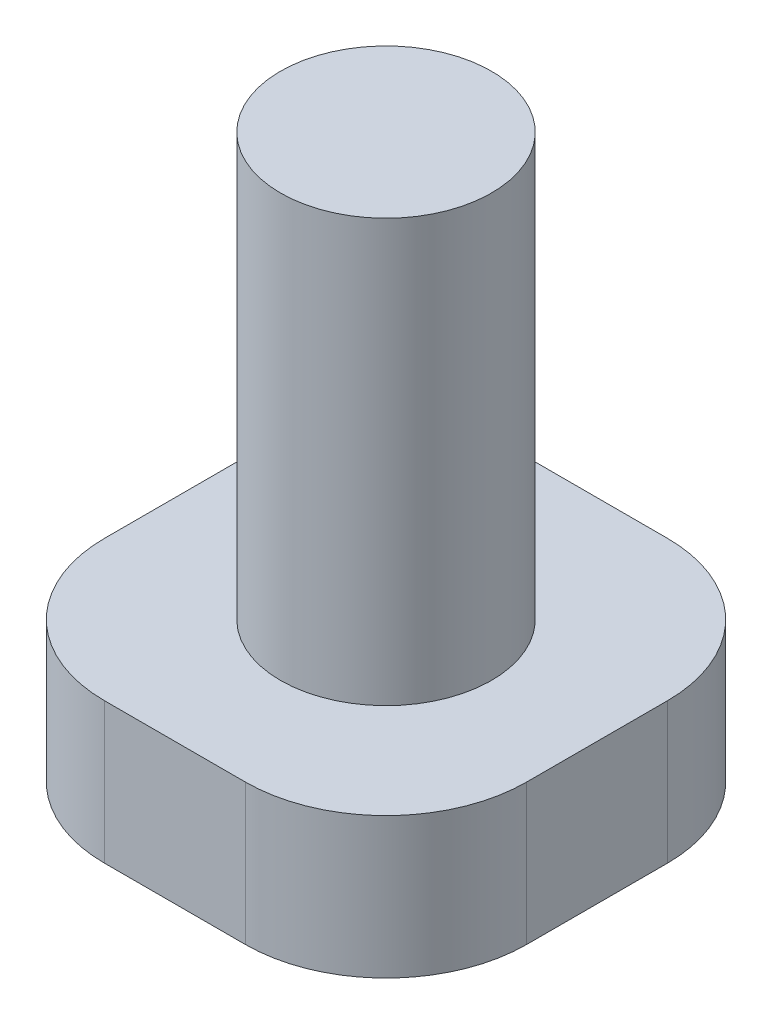
ISO-10303-21;
HEADER;
FILE_DESCRIPTION(('STEP AP214'),'2;1');
FILE_NAME('part.step','',(''),(''),'','','');
FILE_SCHEMA(('AUTOMOTIVE_DESIGN { 1 0 10303 214 1 1 1 1 }'));
ENDSEC;
DATA;
#1=APPLICATION_CONTEXT('core data for automotive mechanical design processes');
#2=APPLICATION_PROTOCOL_DEFINITION('international standard','automotive_design',2000,#1);
#3=PRODUCT_CONTEXT('',#1,'mechanical');
#4=PRODUCT('Part','Part','',(#3));
#5=PRODUCT_RELATED_PRODUCT_CATEGORY('part','',(#4));
#6=PRODUCT_DEFINITION_FORMATION('','',#4);
#7=PRODUCT_DEFINITION_CONTEXT('part definition',#1,'design');
#8=PRODUCT_DEFINITION('design','',#6,#7);
#9=PRODUCT_DEFINITION_SHAPE('','',#8);
#10=(LENGTH_UNIT() NAMED_UNIT(*) SI_UNIT(.MILLI.,.METRE.));
#11=(NAMED_UNIT(*) PLANE_ANGLE_UNIT() SI_UNIT($,.RADIAN.));
#12=(NAMED_UNIT(*) SI_UNIT($,.STERADIAN.) SOLID_ANGLE_UNIT());
#13=UNCERTAINTY_MEASURE_WITH_UNIT(LENGTH_MEASURE(1.E-05),#10,'distance_accuracy_value','');
#14=(GEOMETRIC_REPRESENTATION_CONTEXT(3) GLOBAL_UNCERTAINTY_ASSIGNED_CONTEXT((#13)) GLOBAL_UNIT_ASSIGNED_CONTEXT((#10,
#11,#12)) REPRESENTATION_CONTEXT('',''));
#15=CARTESIAN_POINT('',(0.,0.,0.));
#16=DIRECTION('',(0.,0.,1.));
#17=DIRECTION('',(1.,0.,0.));
#18=AXIS2_PLACEMENT_3D('',#15,#16,#17);
#19=CARTESIAN_POINT('',(0.,10.16,0.));
#20=DIRECTION('',(1.,0.,0.));
#21=DIRECTION('',(0.,0.,-1.));
#22=AXIS2_PLACEMENT_3D('',#19,#20,#21);
#23=PLANE('',#22);
#24=DIRECTION('',(0.,0.,1.));
#25=VECTOR('',#24,1.);
#26=CARTESIAN_POINT('',(0.,0.,0.));
#27=LINE('',#26,#25);
#28=CARTESIAN_POINT('',(0.,0.,-5.08));
#29=VERTEX_POINT('',#28);
#30=CARTESIAN_POINT('',(0.,0.,-2.54));
#31=VERTEX_POINT('',#30);
#32=EDGE_CURVE('E129',#29,#31,#27,.T.);
#33=ORIENTED_EDGE('',*,*,#32,.T.);
#34=DIRECTION('',(0.,-1.,0.));
#35=VECTOR('',#34,1.);
#36=CARTESIAN_POINT('',(0.,10.16,-2.54));
#37=LINE('',#36,#35);
#38=CARTESIAN_POINT('',(0.,2.54,-2.54));
#39=VERTEX_POINT('',#38);
#40=EDGE_CURVE('E48',#31,#39,#37,.F.);
#41=ORIENTED_EDGE('',*,*,#40,.T.);
#42=DIRECTION('',(0.,0.,1.));
#43=VECTOR('',#42,1.);
#44=CARTESIAN_POINT('',(0.,2.54,-7.62));
#45=LINE('',#44,#43);
#46=CARTESIAN_POINT('',(0.,2.54,-5.08));
#47=VERTEX_POINT('',#46);
#48=EDGE_CURVE('E199',#47,#39,#45,.T.);
#49=ORIENTED_EDGE('',*,*,#48,.F.);
#50=DIRECTION('',(0.,-1.,0.));
#51=VECTOR('',#50,1.);
#52=CARTESIAN_POINT('',(0.,10.16,-5.08));
#53=LINE('',#52,#51);
#54=EDGE_CURVE('E117',#47,#29,#53,.T.);
#55=ORIENTED_EDGE('',*,*,#54,.T.);
#56=EDGE_LOOP('',(#33,#41,#49,#55));
#57=FACE_BOUND('',#56,.T.);
#58=ADVANCED_FACE('F39',(#57),#23,.F.);
#59=CARTESIAN_POINT('',(0.,10.16,0.));
#60=DIRECTION('',(0.,0.,-1.));
#61=DIRECTION('',(-1.,0.,0.));
#62=AXIS2_PLACEMENT_3D('',#59,#60,#61);
#63=PLANE('',#62);
#64=DIRECTION('',(1.,0.,0.));
#65=VECTOR('',#64,1.);
#66=CARTESIAN_POINT('',(0.,2.54,0.));
#67=LINE('',#66,#65);
#68=CARTESIAN_POINT('',(2.54,2.54,0.));
#69=VERTEX_POINT('',#68);
#70=CARTESIAN_POINT('',(5.08,2.54,0.));
#71=VERTEX_POINT('',#70);
#72=EDGE_CURVE('E183',#69,#71,#67,.T.);
#73=ORIENTED_EDGE('',*,*,#72,.F.);
#74=DIRECTION('',(0.,-1.,0.));
#75=VECTOR('',#74,1.);
#76=CARTESIAN_POINT('',(2.54,10.16,0.));
#77=LINE('',#76,#75);
#78=CARTESIAN_POINT('',(2.54,0.,0.));
#79=VERTEX_POINT('',#78);
#80=EDGE_CURVE('E172',#69,#79,#77,.T.);
#81=ORIENTED_EDGE('',*,*,#80,.T.);
#82=DIRECTION('',(1.,0.,0.));
#83=VECTOR('',#82,1.);
#84=CARTESIAN_POINT('',(0.,0.,0.));
#85=LINE('',#84,#83);
#86=CARTESIAN_POINT('',(5.08,0.,0.));
#87=VERTEX_POINT('',#86);
#88=EDGE_CURVE('E182',#79,#87,#85,.T.);
#89=ORIENTED_EDGE('',*,*,#88,.T.);
#90=DIRECTION('',(0.,-1.,0.));
#91=VECTOR('',#90,1.);
#92=CARTESIAN_POINT('',(5.08,10.16,0.));
#93=LINE('',#92,#91);
#94=EDGE_CURVE('E165',#87,#71,#93,.F.);
#95=ORIENTED_EDGE('',*,*,#94,.T.);
#96=EDGE_LOOP('',(#73,#81,#89,#95));
#97=FACE_BOUND('',#96,.T.);
#98=ADVANCED_FACE('F181',(#97),#63,.F.);
#99=CARTESIAN_POINT('',(7.62,10.16,0.));
#100=DIRECTION('',(-1.,0.,0.));
#101=DIRECTION('',(0.,0.,1.));
#102=AXIS2_PLACEMENT_3D('',#99,#100,#101);
#103=PLANE('',#102);
#104=DIRECTION('',(0.,0.,-1.));
#105=VECTOR('',#104,1.);
#106=CARTESIAN_POINT('',(7.62,2.54,-7.62));
#107=LINE('',#106,#105);
#108=CARTESIAN_POINT('',(7.62,2.54,-2.54));
#109=VERTEX_POINT('',#108);
#110=CARTESIAN_POINT('',(7.62,2.54,-5.08));
#111=VERTEX_POINT('',#110);
#112=EDGE_CURVE('E111',#109,#111,#107,.T.);
#113=ORIENTED_EDGE('',*,*,#112,.F.);
#114=DIRECTION('',(0.,-1.,0.));
#115=VECTOR('',#114,1.);
#116=CARTESIAN_POINT('',(7.62,10.16,-2.54));
#117=LINE('',#116,#115);
#118=CARTESIAN_POINT('',(7.62,0.,-2.54));
#119=VERTEX_POINT('',#118);
#120=EDGE_CURVE('E157',#109,#119,#117,.T.);
#121=ORIENTED_EDGE('',*,*,#120,.T.);
#122=DIRECTION('',(0.,0.,-1.));
#123=VECTOR('',#122,1.);
#124=CARTESIAN_POINT('',(7.62,0.,0.));
#125=LINE('',#124,#123);
#126=CARTESIAN_POINT('',(7.62,0.,-5.08));
#127=VERTEX_POINT('',#126);
#128=EDGE_CURVE('E140',#119,#127,#125,.T.);
#129=ORIENTED_EDGE('',*,*,#128,.T.);
#130=DIRECTION('',(0.,-1.,0.));
#131=VECTOR('',#130,1.);
#132=CARTESIAN_POINT('',(7.62,10.16,-5.08));
#133=LINE('',#132,#131);
#134=EDGE_CURVE('E118',#127,#111,#133,.F.);
#135=ORIENTED_EDGE('',*,*,#134,.T.);
#136=EDGE_LOOP('',(#113,#121,#129,#135));
#137=FACE_BOUND('',#136,.T.);
#138=ADVANCED_FACE('F229',(#137),#103,.F.);
#139=CARTESIAN_POINT('',(0.,10.16,-7.62));
#140=DIRECTION('',(0.,0.,1.));
#141=DIRECTION('',(1.,0.,0.));
#142=AXIS2_PLACEMENT_3D('',#139,#140,#141);
#143=PLANE('',#142);
#144=DIRECTION('',(-1.,0.,0.));
#145=VECTOR('',#144,1.);
#146=CARTESIAN_POINT('',(0.,0.,-7.62));
#147=LINE('',#146,#145);
#148=CARTESIAN_POINT('',(5.08,0.,-7.62));
#149=VERTEX_POINT('',#148);
#150=CARTESIAN_POINT('',(2.54,0.,-7.62));
#151=VERTEX_POINT('',#150);
#152=EDGE_CURVE('E135',#149,#151,#147,.T.);
#153=ORIENTED_EDGE('',*,*,#152,.T.);
#154=DIRECTION('',(0.,-1.,0.));
#155=VECTOR('',#154,1.);
#156=CARTESIAN_POINT('',(2.54,10.16,-7.62));
#157=LINE('',#156,#155);
#158=CARTESIAN_POINT('',(2.54,2.54,-7.62));
#159=VERTEX_POINT('',#158);
#160=EDGE_CURVE('E127',#151,#159,#157,.F.);
#161=ORIENTED_EDGE('',*,*,#160,.T.);
#162=DIRECTION('',(-1.,0.,0.));
#163=VECTOR('',#162,1.);
#164=CARTESIAN_POINT('',(0.,2.54,-7.62));
#165=LINE('',#164,#163);
#166=CARTESIAN_POINT('',(5.08,2.54,-7.62));
#167=VERTEX_POINT('',#166);
#168=EDGE_CURVE('E108',#167,#159,#165,.T.);
#169=ORIENTED_EDGE('',*,*,#168,.F.);
#170=DIRECTION('',(0.,-1.,0.));
#171=VECTOR('',#170,1.);
#172=CARTESIAN_POINT('',(5.08,10.16,-7.62));
#173=LINE('',#172,#171);
#174=EDGE_CURVE('E124',#167,#149,#173,.T.);
#175=ORIENTED_EDGE('',*,*,#174,.T.);
#176=EDGE_LOOP('',(#153,#161,#169,#175));
#177=FACE_BOUND('',#176,.T.);
#178=ADVANCED_FACE('F123',(#177),#143,.F.);
#179=CARTESIAN_POINT('',(0.,0.,0.));
#180=DIRECTION('',(0.,-1.,0.));
#181=DIRECTION('',(0.,0.,-1.));
#182=AXIS2_PLACEMENT_3D('',#179,#180,#181);
#183=PLANE('',#182);
#184=ORIENTED_EDGE('',*,*,#88,.F.);
#185=CARTESIAN_POINT('',(2.54,0.,-2.54));
#186=DIRECTION('',(0.,-1.,0.));
#187=DIRECTION('',(0.,0.,-1.));
#188=AXIS2_PLACEMENT_3D('',#185,#186,#187);
#189=CIRCLE('',#188,2.54);
#190=EDGE_CURVE('E62',#79,#31,#189,.T.);
#191=ORIENTED_EDGE('',*,*,#190,.T.);
#192=ORIENTED_EDGE('',*,*,#32,.F.);
#193=CARTESIAN_POINT('',(2.54,0.,-5.08));
#194=DIRECTION('',(0.,-1.,0.));
#195=DIRECTION('',(0.,0.,-1.));
#196=AXIS2_PLACEMENT_3D('',#193,#194,#195);
#197=CIRCLE('',#196,2.54);
#198=EDGE_CURVE('E149',#29,#151,#197,.T.);
#199=ORIENTED_EDGE('',*,*,#198,.T.);
#200=ORIENTED_EDGE('',*,*,#152,.F.);
#201=CARTESIAN_POINT('',(5.08,0.,-5.08));
#202=DIRECTION('',(0.,-1.,0.));
#203=DIRECTION('',(0.,0.,-1.));
#204=AXIS2_PLACEMENT_3D('',#201,#202,#203);
#205=CIRCLE('',#204,2.54);
#206=EDGE_CURVE('E133',#149,#127,#205,.T.);
#207=ORIENTED_EDGE('',*,*,#206,.T.);
#208=ORIENTED_EDGE('',*,*,#128,.F.);
#209=CARTESIAN_POINT('',(5.08,0.,-2.54));
#210=DIRECTION('',(0.,-1.,0.));
#211=DIRECTION('',(0.,0.,-1.));
#212=AXIS2_PLACEMENT_3D('',#209,#210,#211);
#213=CIRCLE('',#212,2.54);
#214=EDGE_CURVE('E161',#119,#87,#213,.T.);
#215=ORIENTED_EDGE('',*,*,#214,.T.);
#216=EDGE_LOOP('',(#184,#191,#192,#199,#200,#207,#208,#215));
#217=FACE_BOUND('',#216,.T.);
#218=ADVANCED_FACE('F186',(#217),#183,.T.);
#219=CARTESIAN_POINT('',(0.,2.54,0.));
#220=DIRECTION('',(0.,1.,0.));
#221=DIRECTION('',(0.,0.,1.));
#222=AXIS2_PLACEMENT_3D('',#219,#220,#221);
#223=PLANE('',#222);
#224=CARTESIAN_POINT('',(3.81,2.54,-3.81));
#225=DIRECTION('',(0.,1.,0.));
#226=DIRECTION('',(0.,0.,1.));
#227=AXIS2_PLACEMENT_3D('',#224,#225,#226);
#228=CIRCLE('',#227,1.905);
#229=CARTESIAN_POINT('',(3.81,2.54,-1.905));
#230=VERTEX_POINT('',#229);
#231=EDGE_CURVE('E202',#230,#230,#228,.T.);
#232=ORIENTED_EDGE('',*,*,#231,.F.);
#233=EDGE_LOOP('',(#232));
#234=FACE_BOUND('',#233,.T.);
#235=ORIENTED_EDGE('',*,*,#48,.T.);
#236=CARTESIAN_POINT('',(2.54,2.54,-2.54));
#237=DIRECTION('',(0.,1.,0.));
#238=DIRECTION('',(0.,0.,1.));
#239=AXIS2_PLACEMENT_3D('',#236,#237,#238);
#240=CIRCLE('',#239,2.54);
#241=EDGE_CURVE('E11',#39,#69,#240,.T.);
#242=ORIENTED_EDGE('',*,*,#241,.T.);
#243=ORIENTED_EDGE('',*,*,#72,.T.);
#244=CARTESIAN_POINT('',(5.08,2.54,-2.54));
#245=DIRECTION('',(0.,1.,0.));
#246=DIRECTION('',(0.,0.,1.));
#247=AXIS2_PLACEMENT_3D('',#244,#245,#246);
#248=CIRCLE('',#247,2.54);
#249=EDGE_CURVE('E169',#71,#109,#248,.T.);
#250=ORIENTED_EDGE('',*,*,#249,.T.);
#251=ORIENTED_EDGE('',*,*,#112,.T.);
#252=CARTESIAN_POINT('',(5.08,2.54,-5.08));
#253=DIRECTION('',(0.,1.,0.));
#254=DIRECTION('',(0.,0.,1.));
#255=AXIS2_PLACEMENT_3D('',#252,#253,#254);
#256=CIRCLE('',#255,2.54);
#257=EDGE_CURVE('E105',#111,#167,#256,.T.);
#258=ORIENTED_EDGE('',*,*,#257,.T.);
#259=ORIENTED_EDGE('',*,*,#168,.T.);
#260=CARTESIAN_POINT('',(2.54,2.54,-5.08));
#261=DIRECTION('',(0.,1.,0.));
#262=DIRECTION('',(0.,0.,1.));
#263=AXIS2_PLACEMENT_3D('',#260,#261,#262);
#264=CIRCLE('',#263,2.54);
#265=EDGE_CURVE('E154',#159,#47,#264,.T.);
#266=ORIENTED_EDGE('',*,*,#265,.T.);
#267=EDGE_LOOP('',(#235,#242,#243,#250,#251,#258,#259,#266));
#268=FACE_BOUND('',#267,.T.);
#269=ADVANCED_FACE('F107',(#234,#268),#223,.T.);
#270=CARTESIAN_POINT('',(3.81,2.54,-3.81));
#271=DIRECTION('',(0.,1.,0.));
#272=DIRECTION('',(0.,0.,1.));
#273=AXIS2_PLACEMENT_3D('',#270,#271,#272);
#274=CYLINDRICAL_SURFACE('',#273,1.905);
#275=CARTESIAN_POINT('',(3.81,10.16,-3.81));
#276=DIRECTION('',(0.,1.,0.));
#277=DIRECTION('',(0.,0.,1.));
#278=AXIS2_PLACEMENT_3D('',#275,#276,#277);
#279=CIRCLE('',#278,1.905);
#280=CARTESIAN_POINT('',(3.81,10.16,-1.905));
#281=VERTEX_POINT('',#280);
#282=EDGE_CURVE('E203',#281,#281,#279,.T.);
#283=CARTESIAN_POINT('',(3.81,2.54,-1.905));
#284=CARTESIAN_POINT('',(3.81,2.619375,-1.905));
#285=CARTESIAN_POINT('',(3.81,2.69875,-1.905));
#286=CARTESIAN_POINT('',(3.81,2.8575,-1.905));
#287=CARTESIAN_POINT('',(3.81,2.936875,-1.905));
#288=CARTESIAN_POINT('',(3.81,3.095625,-1.905));
#289=CARTESIAN_POINT('',(3.81,3.175,-1.905));
#290=CARTESIAN_POINT('',(3.81,3.33375,-1.905));
#291=CARTESIAN_POINT('',(3.81,3.413125,-1.905));
#292=CARTESIAN_POINT('',(3.81,3.571875,-1.905));
#293=CARTESIAN_POINT('',(3.81,3.65125,-1.905));
#294=CARTESIAN_POINT('',(3.81,3.81,-1.905));
#295=CARTESIAN_POINT('',(3.81,3.889375,-1.905));
#296=CARTESIAN_POINT('',(3.81,4.048125,-1.905));
#297=CARTESIAN_POINT('',(3.81,4.1275,-1.905));
#298=CARTESIAN_POINT('',(3.81,4.28625,-1.905));
#299=CARTESIAN_POINT('',(3.81,4.365625,-1.905));
#300=CARTESIAN_POINT('',(3.81,4.524375,-1.905));
#301=CARTESIAN_POINT('',(3.81,4.60375,-1.905));
#302=CARTESIAN_POINT('',(3.81,4.7625,-1.905));
#303=CARTESIAN_POINT('',(3.81,4.841875,-1.905));
#304=CARTESIAN_POINT('',(3.81,5.000625,-1.905));
#305=CARTESIAN_POINT('',(3.81,5.08,-1.905));
#306=CARTESIAN_POINT('',(3.81,5.23875,-1.905));
#307=CARTESIAN_POINT('',(3.81,5.318125,-1.905));
#308=CARTESIAN_POINT('',(3.81,5.476875,-1.905));
#309=CARTESIAN_POINT('',(3.81,5.55625,-1.905));
#310=CARTESIAN_POINT('',(3.81,5.715,-1.905));
#311=CARTESIAN_POINT('',(3.81,5.794375,-1.905));
#312=CARTESIAN_POINT('',(3.81,5.953125,-1.905));
#313=CARTESIAN_POINT('',(3.81,6.0325,-1.905));
#314=CARTESIAN_POINT('',(3.81,6.19125,-1.905));
#315=CARTESIAN_POINT('',(3.81,6.270625,-1.905));
#316=CARTESIAN_POINT('',(3.81,6.429375,-1.905));
#317=CARTESIAN_POINT('',(3.81,6.50875,-1.905));
#318=CARTESIAN_POINT('',(3.81,6.6675,-1.905));
#319=CARTESIAN_POINT('',(3.81,6.746875,-1.905));
#320=CARTESIAN_POINT('',(3.81,6.905625,-1.905));
#321=CARTESIAN_POINT('',(3.81,6.985,-1.905));
#322=CARTESIAN_POINT('',(3.81,7.14375,-1.905));
#323=CARTESIAN_POINT('',(3.81,7.223125,-1.905));
#324=CARTESIAN_POINT('',(3.81,7.381875,-1.905));
#325=CARTESIAN_POINT('',(3.81,7.46125,-1.905));
#326=CARTESIAN_POINT('',(3.81,7.62,-1.905));
#327=CARTESIAN_POINT('',(3.81,7.699375,-1.905));
#328=CARTESIAN_POINT('',(3.81,7.858125,-1.905));
#329=CARTESIAN_POINT('',(3.81,7.9375,-1.905));
#330=CARTESIAN_POINT('',(3.81,8.09625,-1.905));
#331=CARTESIAN_POINT('',(3.81,8.175625,-1.905));
#332=CARTESIAN_POINT('',(3.81,8.334375,-1.905));
#333=CARTESIAN_POINT('',(3.81,8.41375,-1.905));
#334=CARTESIAN_POINT('',(3.81,8.5725,-1.905));
#335=CARTESIAN_POINT('',(3.81,8.651875,-1.905));
#336=CARTESIAN_POINT('',(3.81,8.810625,-1.905));
#337=CARTESIAN_POINT('',(3.81,8.89,-1.905));
#338=CARTESIAN_POINT('',(3.81,9.04875,-1.905));
#339=CARTESIAN_POINT('',(3.81,9.128125,-1.905));
#340=CARTESIAN_POINT('',(3.81,9.286875,-1.905));
#341=CARTESIAN_POINT('',(3.81,9.36625,-1.905));
#342=CARTESIAN_POINT('',(3.81,9.525,-1.905));
#343=CARTESIAN_POINT('',(3.81,9.604375,-1.905));
#344=CARTESIAN_POINT('',(3.81,9.763125,-1.905));
#345=CARTESIAN_POINT('',(3.81,9.8425,-1.905));
#346=CARTESIAN_POINT('',(3.81,10.00125,-1.905));
#347=CARTESIAN_POINT('',(3.81,10.080625,-1.905));
#348=CARTESIAN_POINT('',(3.81,10.16,-1.905));
#349=B_SPLINE_CURVE_WITH_KNOTS('',3,(#283,#284,#285,#286,#287,#288,#289,#290,#291,#292,#293,
#294,#295,#296,#297,#298,#299,#300,#301,#302,#303,#304,#305,#306,#307,#308,#309,#310,#311,#312,
#313,#314,#315,#316,#317,#318,#319,#320,#321,#322,#323,#324,#325,#326,#327,#328,#329,#330,#331,
#332,#333,#334,#335,#336,#337,#338,#339,#340,#341,#342,#343,#344,#345,#346,#347,#348),
.UNSPECIFIED.,.F.,.F.,(4,2,2,2,2,2,2,2,2,2,2,2,2,2,2,2,2,2,2,2,2,2,2,2,2,2,2,2,2,2,2,2,4),(0.,
0.238125,0.47625,0.714375,0.9525,1.190625,1.42875,1.666875,1.905,2.143125,2.38125,2.619375,
2.8575,3.095625,3.33375,3.571875,3.81,4.048125,4.28625,4.524375,4.7625,5.000625,5.23875,
5.476875,5.715,5.953125,6.19125,6.429375,6.6675,6.905625,7.14375,7.381875,7.62),.UNSPECIFIED.);
#350=EDGE_CURVE('BSEAM211',#230,#281,#349,.T.);
#351=ORIENTED_EDGE('',*,*,#231,.T.);
#352=ORIENTED_EDGE('',*,*,#282,.F.);
#353=ORIENTED_EDGE('',*,*,#350,.T.);
#354=ORIENTED_EDGE('',*,*,#350,.F.);
#355=EDGE_LOOP('',(#351,#353,#352,#354));
#356=FACE_BOUND('',#355,.T.);
#357=ADVANCED_FACE('F211',(#356),#274,.T.);
#358=CARTESIAN_POINT('',(0.,10.16,0.));
#359=DIRECTION('',(0.,-1.,0.));
#360=DIRECTION('',(0.,0.,-1.));
#361=AXIS2_PLACEMENT_3D('',#358,#359,#360);
#362=PLANE('',#361);
#363=ORIENTED_EDGE('',*,*,#282,.T.);
#364=EDGE_LOOP('',(#363));
#365=FACE_BOUND('',#364,.T.);
#366=ADVANCED_FACE('F220',(#365),#362,.F.);
#367=CARTESIAN_POINT('',(5.08,10.16,-5.08));
#368=DIRECTION('',(0.,-1.,0.));
#369=DIRECTION('',(0.,0.,-1.));
#370=AXIS2_PLACEMENT_3D('',#367,#368,#369);
#371=CYLINDRICAL_SURFACE('',#370,2.54);
#372=ORIENTED_EDGE('',*,*,#257,.F.);
#373=ORIENTED_EDGE('',*,*,#134,.F.);
#374=ORIENTED_EDGE('',*,*,#206,.F.);
#375=ORIENTED_EDGE('',*,*,#174,.F.);
#376=EDGE_LOOP('',(#372,#373,#374,#375));
#377=FACE_BOUND('',#376,.T.);
#378=ADVANCED_FACE('F131',(#377),#371,.T.);
#379=CARTESIAN_POINT('',(2.54,10.16,-5.08));
#380=DIRECTION('',(0.,-1.,0.));
#381=DIRECTION('',(0.,0.,-1.));
#382=AXIS2_PLACEMENT_3D('',#379,#380,#381);
#383=CYLINDRICAL_SURFACE('',#382,2.54);
#384=ORIENTED_EDGE('',*,*,#265,.F.);
#385=ORIENTED_EDGE('',*,*,#160,.F.);
#386=ORIENTED_EDGE('',*,*,#198,.F.);
#387=ORIENTED_EDGE('',*,*,#54,.F.);
#388=EDGE_LOOP('',(#384,#385,#386,#387));
#389=FACE_BOUND('',#388,.T.);
#390=ADVANCED_FACE('F235',(#389),#383,.T.);
#391=CARTESIAN_POINT('',(5.08,10.16,-2.54));
#392=DIRECTION('',(0.,-1.,0.));
#393=DIRECTION('',(0.,0.,-1.));
#394=AXIS2_PLACEMENT_3D('',#391,#392,#393);
#395=CYLINDRICAL_SURFACE('',#394,2.54);
#396=ORIENTED_EDGE('',*,*,#249,.F.);
#397=ORIENTED_EDGE('',*,*,#94,.F.);
#398=ORIENTED_EDGE('',*,*,#214,.F.);
#399=ORIENTED_EDGE('',*,*,#120,.F.);
#400=EDGE_LOOP('',(#396,#397,#398,#399));
#401=FACE_BOUND('',#400,.T.);
#402=ADVANCED_FACE('F237',(#401),#395,.T.);
#403=CARTESIAN_POINT('',(2.54,10.16,-2.54));
#404=DIRECTION('',(0.,-1.,0.));
#405=DIRECTION('',(0.,0.,-1.));
#406=AXIS2_PLACEMENT_3D('',#403,#404,#405);
#407=CYLINDRICAL_SURFACE('',#406,2.54);
#408=ORIENTED_EDGE('',*,*,#241,.F.);
#409=ORIENTED_EDGE('',*,*,#40,.F.);
#410=ORIENTED_EDGE('',*,*,#190,.F.);
#411=ORIENTED_EDGE('',*,*,#80,.F.);
#412=EDGE_LOOP('',(#408,#409,#410,#411));
#413=FACE_BOUND('',#412,.T.);
#414=ADVANCED_FACE('F41',(#413),#407,.T.);
#415=CLOSED_SHELL('',(#58,#98,#138,#178,#218,#269,#357,#366,#378,#390,#402,#414));
#416=MANIFOLD_SOLID_BREP('B2',#415);
#417=ADVANCED_BREP_SHAPE_REPRESENTATION('',(#18,#416),#14);
#418=SHAPE_DEFINITION_REPRESENTATION(#9,#417);
ENDSEC;
END-ISO-10303-21;
